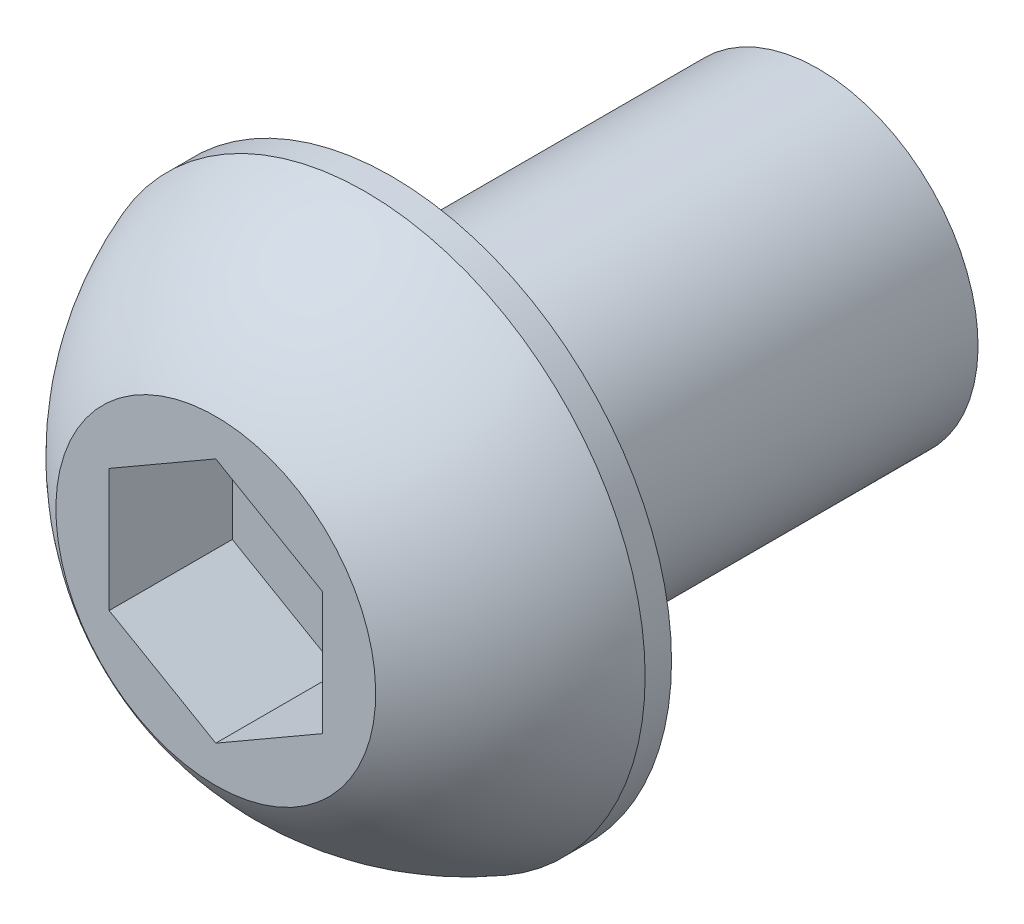
ISO-10303-21;
HEADER;
FILE_DESCRIPTION(('STEP AP214'),'2;1');
FILE_NAME('part.step','',(''),(''),'','','');
FILE_SCHEMA(('AUTOMOTIVE_DESIGN { 1 0 10303 214 1 1 1 1 }'));
ENDSEC;
DATA;
#1=APPLICATION_CONTEXT('core data for automotive mechanical design processes');
#2=APPLICATION_PROTOCOL_DEFINITION('international standard','automotive_design',2000,#1);
#3=PRODUCT_CONTEXT('',#1,'mechanical');
#4=PRODUCT('Part','Part','',(#3));
#5=PRODUCT_RELATED_PRODUCT_CATEGORY('part','',(#4));
#6=PRODUCT_DEFINITION_FORMATION('','',#4);
#7=PRODUCT_DEFINITION_CONTEXT('part definition',#1,'design');
#8=PRODUCT_DEFINITION('design','',#6,#7);
#9=PRODUCT_DEFINITION_SHAPE('','',#8);
#10=(LENGTH_UNIT() NAMED_UNIT(*) SI_UNIT(.MILLI.,.METRE.));
#11=(NAMED_UNIT(*) PLANE_ANGLE_UNIT() SI_UNIT($,.RADIAN.));
#12=(NAMED_UNIT(*) SI_UNIT($,.STERADIAN.) SOLID_ANGLE_UNIT());
#13=UNCERTAINTY_MEASURE_WITH_UNIT(LENGTH_MEASURE(1.E-05),#10,'distance_accuracy_value','');
#14=(GEOMETRIC_REPRESENTATION_CONTEXT(3) GLOBAL_UNCERTAINTY_ASSIGNED_CONTEXT((#13)) GLOBAL_UNIT_ASSIGNED_CONTEXT((#10,
#11,#12)) REPRESENTATION_CONTEXT('',''));
#15=CARTESIAN_POINT('',(0.,0.,0.));
#16=DIRECTION('',(0.,0.,1.));
#17=DIRECTION('',(1.,0.,0.));
#18=AXIS2_PLACEMENT_3D('',#15,#16,#17);
#19=CARTESIAN_POINT('',(0.,-3.,-11.3));
#20=DIRECTION('',(0.,0.,-1.));
#21=DIRECTION('',(0.,1.,0.));
#22=AXIS2_PLACEMENT_3D('',#19,#20,#21);
#23=PLANE('',#22);
#24=CARTESIAN_POINT('',(0.,0.,-11.3));
#25=DIRECTION('',(0.,0.,-1.));
#26=DIRECTION('',(0.,1.,0.));
#27=AXIS2_PLACEMENT_3D('',#24,#25,#26);
#28=CIRCLE('',#27,3.);
#29=CARTESIAN_POINT('',(0.,3.,-11.3));
#30=VERTEX_POINT('',#29);
#31=EDGE_CURVE('E11',#30,#30,#28,.T.);
#32=ORIENTED_EDGE('',*,*,#31,.T.);
#33=EDGE_LOOP('',(#32));
#34=FACE_BOUND('',#33,.T.);
#35=ADVANCED_FACE('F37',(#34),#23,.T.);
#36=CARTESIAN_POINT('',(0.,0.,-11.3));
#37=DIRECTION('',(0.,0.,-1.));
#38=DIRECTION('',(0.,1.,0.));
#39=AXIS2_PLACEMENT_3D('',#36,#37,#38);
#40=CYLINDRICAL_SURFACE('',#39,3.);
#41=CARTESIAN_POINT('',(0.,0.,-3.3));
#42=DIRECTION('',(0.,0.,1.));
#43=DIRECTION('',(1.,0.,0.));
#44=AXIS2_PLACEMENT_3D('',#41,#42,#43);
#45=CIRCLE('',#44,3.);
#46=CARTESIAN_POINT('',(3.,0.,-3.3));
#47=VERTEX_POINT('',#46);
#48=EDGE_CURVE('E44',#47,#47,#45,.F.);
#49=ORIENTED_EDGE('',*,*,#48,.T.);
#50=EDGE_LOOP('',(#49));
#51=FACE_BOUND('',#50,.T.);
#52=ORIENTED_EDGE('',*,*,#31,.F.);
#53=EDGE_LOOP('',(#52));
#54=FACE_BOUND('',#53,.T.);
#55=ADVANCED_FACE('F154',(#51,#54),#40,.T.);
#56=CARTESIAN_POINT('',(0.,0.,-4.71132352941176));
#57=DIRECTION('',(0.,0.,1.));
#58=DIRECTION('',(0.,-1.,0.));
#59=AXIS2_PLACEMENT_3D('',#56,#57,#58);
#60=SPHERICAL_SURFACE('',#59,5.58538892099636);
#61=CARTESIAN_POINT('',(0.,0.,0.));
#62=DIRECTION('',(0.,0.,1.));
#63=DIRECTION('',(1.,0.,0.));
#64=AXIS2_PLACEMENT_3D('',#61,#62,#63);
#65=CIRCLE('',#64,3.);
#66=CARTESIAN_POINT('',(0.,-3.,0.));
#67=VERTEX_POINT('',#66);
#68=EDGE_CURVE('E149',#67,#67,#65,.T.);
#69=CARTESIAN_POINT('',(0.,0.,-2.805));
#70=DIRECTION('',(0.,0.,1.));
#71=DIRECTION('',(1.,0.,0.));
#72=AXIS2_PLACEMENT_3D('',#69,#70,#71);
#73=CIRCLE('',#72,5.25);
#74=CARTESIAN_POINT('',(0.,-5.25,-2.805));
#75=VERTEX_POINT('',#74);
#76=EDGE_CURVE('E138',#75,#75,#73,.T.);
#77=CARTESIAN_POINT('',(0.,-3.,0.));
#78=CARTESIAN_POINT('',(0.,-3.03216841047471,-0.0204836076687075));
#79=CARTESIAN_POINT('',(0.,-3.06412696701745,-0.041296774706015));
#80=CARTESIAN_POINT('',(0.,-3.12761110680185,-0.0835732798883759));
#81=CARTESIAN_POINT('',(0.,-3.1591366900435,-0.105036618033429));
#82=CARTESIAN_POINT('',(0.,-3.22174161778856,-0.148604517801824));
#83=CARTESIAN_POINT('',(0.,-3.25282096229196,-0.170709079425165));
#84=CARTESIAN_POINT('',(0.,-3.3145203830256,-0.215550136391723));
#85=CARTESIAN_POINT('',(0.,-3.34514045925583,-0.238286631734939));
#86=CARTESIAN_POINT('',(0.,-3.40590849355866,-0.284382020830629));
#87=CARTESIAN_POINT('',(0.,-3.43605645163127,-0.307740914583101));
#88=CARTESIAN_POINT('',(0.,-3.49586760131366,-0.355071298801884));
#89=CARTESIAN_POINT('',(0.,-3.52553079292345,-0.379042789268194));
#90=CARTESIAN_POINT('',(0.,-3.58435996382991,-0.427588309600938));
#91=CARTESIAN_POINT('',(0.,-3.61352594312657,-0.452162339467372));
#92=CARTESIAN_POINT('',(0.,-3.67134845242053,-0.501902628105114));
#93=CARTESIAN_POINT('',(0.,-3.70000498241782,-0.527068886876422));
#94=CARTESIAN_POINT('',(0.,-3.7567965698069,-0.577983074450792));
#95=CARTESIAN_POINT('',(0.,-3.78493162719868,-0.603731003253854));
#96=CARTESIAN_POINT('',(0.,-3.84066846488057,-0.65579772794287));
#97=CARTESIAN_POINT('',(0.,-3.86827024517066,-0.682116523828823));
#98=CARTESIAN_POINT('',(0.,-3.92292894789283,-0.735313940225864));
#99=CARTESIAN_POINT('',(0.,-3.94998587032491,-0.762192560736952));
#100=CARTESIAN_POINT('',(0.,-4.00354350517958,-0.816498349041451));
#101=CARTESIAN_POINT('',(0.,-4.03004421760217,-0.843925516834863));
#102=CARTESIAN_POINT('',(0.,-4.08247831365261,-0.899316892210194));
#103=CARTESIAN_POINT('',(0.,-4.10841169728045,-0.927281099792113));
#104=CARTESIAN_POINT('',(0.,-4.1597002549878,-0.983734821927126));
#105=CARTESIAN_POINT('',(0.,-4.18505542906731,-1.01222433648022));
#106=CARTESIAN_POINT('',(0.,-4.23517692952119,-1.06971671933959));
#107=CARTESIAN_POINT('',(0.,-4.25994325589556,-1.09871958764587));
#108=CARTESIAN_POINT('',(0.,-4.30887666984256,-1.15722650940808));
#109=CARTESIAN_POINT('',(0.,-4.33304375741518,-1.18673056286401));
#110=CARTESIAN_POINT('',(0.,-4.38076855408201,-1.24622747604199));
#111=CARTESIAN_POINT('',(0.,-4.40432626317621,-1.27622033576403));
#112=CARTESIAN_POINT('',(0.,-4.45082241888372,-1.33668227750444));
#113=CARTESIAN_POINT('',(0.,-4.47376086549703,-1.3671513595228));
#114=CARTESIAN_POINT('',(0.,-4.51900887206146,-1.4285529620796));
#115=CARTESIAN_POINT('',(0.,-4.54131843201258,-1.45948548261803));
#116=CARTESIAN_POINT('',(0.,-4.58529930493053,-1.52180098399588));
#117=CARTESIAN_POINT('',(0.,-4.60697061789735,-1.5531839648353));
#118=CARTESIAN_POINT('',(0.,-4.64966590431095,-1.61638721959847));
#119=CARTESIAN_POINT('',(0.,-4.67068987775773,-1.64820749352221));
#120=CARTESIAN_POINT('',(0.,-4.71208166419702,-1.71227198376418));
#121=CARTESIAN_POINT('',(0.,-4.73244947718953,-1.74451620008241));
#122=CARTESIAN_POINT('',(0.,-4.77252039708775,-1.80941504655213));
#123=CARTESIAN_POINT('',(0.,-4.79222350399347,-1.84206967670363));
#124=CARTESIAN_POINT('',(0.,-4.83095674497554,-1.90777565008234));
#125=CARTESIAN_POINT('',(0.,-4.84998687905189,-1.94082699330955));
#126=CARTESIAN_POINT('',(0.,-4.8873661899807,-2.00731252563814));
#127=CARTESIAN_POINT('',(0.,-4.90571536683316,-2.04074671473953));
#128=CARTESIAN_POINT('',(0.,-4.94172506465618,-2.10798391097428));
#129=CARTESIAN_POINT('',(0.,-4.95938558562673,-2.14178691810765));
#130=CARTESIAN_POINT('',(0.,-4.99401056185103,-2.20974756786458));
#131=CARTESIAN_POINT('',(0.,-5.01097501710478,-2.24390521048815));
#132=CARTESIAN_POINT('',(0.,-5.04420074452798,-2.31256079972767));
#133=CARTESIAN_POINT('',(0.,-5.06046201669743,-2.34705874634363));
#134=CARTESIAN_POINT('',(0.,-5.09227455404011,-2.41638046989934));
#135=CARTESIAN_POINT('',(0.,-5.10782581921333,-2.45120424683909));
#136=CARTESIAN_POINT('',(0.,-5.13821182242717,-2.52116301839372));
#137=CARTESIAN_POINT('',(0.,-5.15304656046779,-2.5562980130086));
#138=CARTESIAN_POINT('',(0.,-5.18199326796146,-2.62686448517116));
#139=CARTESIAN_POINT('',(0.,-5.19610523741451,-2.66229596271883));
#140=CARTESIAN_POINT('',(0.,-5.22360055144049,-2.7334405099534));
#141=CARTESIAN_POINT('',(0.,-5.23698389601341,-2.76915357964029));
#142=CARTESIAN_POINT('',(0.,-5.25,-2.805));
#143=B_SPLINE_CURVE_WITH_KNOTS('',3,(#77,#78,#79,#80,#81,#82,#83,#84,#85,#86,#87,#88,#89,#90,
#91,#92,#93,#94,#95,#96,#97,#98,#99,#100,#101,#102,#103,#104,#105,#106,#107,#108,#109,#110,#111,
#112,#113,#114,#115,#116,#117,#118,#119,#120,#121,#122,#123,#124,#125,#126,#127,#128,#129,#130,
#131,#132,#133,#134,#135,#136,#137,#138,#139,#140,#141,#142),.UNSPECIFIED.,.F.,.F.,(4,2,2,2,2,2,
2,2,2,2,2,2,2,2,2,2,2,2,2,2,2,2,2,2,2,2,2,2,2,2,2,2,4),(0.,0.114407188898183,0.228814377796368,
0.343221566694552,0.457628755592736,0.57203594449092,0.686443133389104,0.800850322287287,
0.915257511185472,1.02966470008366,1.14407188898184,1.25847907788002,1.37288626677821,
1.48729345567639,1.60170064457457,1.71610783347276,1.83051502237094,1.94492221126913,
2.05932940016731,2.17373658906549,2.28814377796368,2.40255096686186,2.51695815576005,
2.63136534465823,2.74577253355641,2.8601797224546,2.97458691135278,3.08899410025097,
3.20340128914915,3.31780847804733,3.43221566694552,3.5466228558437,3.66103004474188),.UNSPECIFIED.);
#144=EDGE_CURVE('BSEAM180',#67,#75,#143,.T.);
#145=ORIENTED_EDGE('',*,*,#68,.F.);
#146=ORIENTED_EDGE('',*,*,#76,.T.);
#147=ORIENTED_EDGE('',*,*,#144,.T.);
#148=ORIENTED_EDGE('',*,*,#144,.F.);
#149=EDGE_LOOP('',(#145,#147,#146,#148));
#150=FACE_BOUND('',#149,.T.);
#151=ADVANCED_FACE('F180',(#150),#60,.T.);
#152=CARTESIAN_POINT('',(0.,-3.,0.));
#153=DIRECTION('',(0.,0.,-1.));
#154=DIRECTION('',(-1.,0.,0.));
#155=AXIS2_PLACEMENT_3D('',#152,#153,#154);
#156=PLANE('',#155);
#157=DIRECTION('',(0.,1.,0.));
#158=VECTOR('',#157,1.);
#159=CARTESIAN_POINT('',(2.,-1.15470053837925,0.));
#160=LINE('',#159,#158);
#161=CARTESIAN_POINT('',(2.,-1.15470053837925,0.));
#162=VERTEX_POINT('',#161);
#163=CARTESIAN_POINT('',(2.,1.15470053837925,0.));
#164=VERTEX_POINT('',#163);
#165=EDGE_CURVE('E125',#162,#164,#160,.T.);
#166=ORIENTED_EDGE('',*,*,#165,.F.);
#167=DIRECTION('',(0.866025403784438,0.5,0.));
#168=VECTOR('',#167,1.);
#169=CARTESIAN_POINT('',(0.,-2.3094010767585,0.));
#170=LINE('',#169,#168);
#171=CARTESIAN_POINT('',(0.,-2.3094010767585,0.));
#172=VERTEX_POINT('',#171);
#173=EDGE_CURVE('E51',#172,#162,#170,.T.);
#174=ORIENTED_EDGE('',*,*,#173,.F.);
#175=DIRECTION('',(0.866025403784439,-0.5,0.));
#176=VECTOR('',#175,1.);
#177=CARTESIAN_POINT('',(-2.,-1.15470053837925,0.));
#178=LINE('',#177,#176);
#179=CARTESIAN_POINT('',(-2.,-1.15470053837925,0.));
#180=VERTEX_POINT('',#179);
#181=EDGE_CURVE('E134',#180,#172,#178,.T.);
#182=ORIENTED_EDGE('',*,*,#181,.F.);
#183=DIRECTION('',(0.,-1.,0.));
#184=VECTOR('',#183,1.);
#185=CARTESIAN_POINT('',(-2.,1.15470053837925,0.));
#186=LINE('',#185,#184);
#187=CARTESIAN_POINT('',(-2.,1.15470053837925,0.));
#188=VERTEX_POINT('',#187);
#189=EDGE_CURVE('E132',#188,#180,#186,.T.);
#190=ORIENTED_EDGE('',*,*,#189,.F.);
#191=DIRECTION('',(-0.866025403784438,-0.5,0.));
#192=VECTOR('',#191,1.);
#193=CARTESIAN_POINT('',(0.,2.3094010767585,0.));
#194=LINE('',#193,#192);
#195=CARTESIAN_POINT('',(0.,2.3094010767585,0.));
#196=VERTEX_POINT('',#195);
#197=EDGE_CURVE('E99',#196,#188,#194,.T.);
#198=ORIENTED_EDGE('',*,*,#197,.F.);
#199=DIRECTION('',(-0.866025403784439,0.5,0.));
#200=VECTOR('',#199,1.);
#201=CARTESIAN_POINT('',(2.,1.15470053837925,0.));
#202=LINE('',#201,#200);
#203=EDGE_CURVE('E128',#164,#196,#202,.T.);
#204=ORIENTED_EDGE('',*,*,#203,.F.);
#205=EDGE_LOOP('',(#166,#174,#182,#190,#198,#204));
#206=FACE_BOUND('',#205,.T.);
#207=ORIENTED_EDGE('',*,*,#68,.T.);
#208=EDGE_LOOP('',(#207));
#209=FACE_BOUND('',#208,.T.);
#210=ADVANCED_FACE('F161',(#206,#209),#156,.F.);
#211=CARTESIAN_POINT('',(0.,-5.25,-3.3));
#212=DIRECTION('',(0.,0.,1.));
#213=DIRECTION('',(1.,0.,0.));
#214=AXIS2_PLACEMENT_3D('',#211,#212,#213);
#215=PLANE('',#214);
#216=ORIENTED_EDGE('',*,*,#48,.F.);
#217=EDGE_LOOP('',(#216));
#218=FACE_BOUND('',#217,.T.);
#219=CARTESIAN_POINT('',(0.,0.,-3.3));
#220=DIRECTION('',(0.,0.,1.));
#221=DIRECTION('',(1.,0.,0.));
#222=AXIS2_PLACEMENT_3D('',#219,#220,#221);
#223=CIRCLE('',#222,5.25);
#224=CARTESIAN_POINT('',(5.25,0.,-3.3));
#225=VERTEX_POINT('',#224);
#226=EDGE_CURVE('E146',#225,#225,#223,.T.);
#227=ORIENTED_EDGE('',*,*,#226,.F.);
#228=EDGE_LOOP('',(#227));
#229=FACE_BOUND('',#228,.T.);
#230=ADVANCED_FACE('F157',(#218,#229),#215,.F.);
#231=CARTESIAN_POINT('',(0.,0.,0.));
#232=DIRECTION('',(0.,0.,1.));
#233=DIRECTION('',(1.,0.,0.));
#234=AXIS2_PLACEMENT_3D('',#231,#232,#233);
#235=CYLINDRICAL_SURFACE('',#234,5.25);
#236=ORIENTED_EDGE('',*,*,#76,.F.);
#237=EDGE_LOOP('',(#236));
#238=FACE_BOUND('',#237,.T.);
#239=ORIENTED_EDGE('',*,*,#226,.T.);
#240=EDGE_LOOP('',(#239));
#241=FACE_BOUND('',#240,.T.);
#242=ADVANCED_FACE('F160',(#238,#241),#235,.T.);
#243=CARTESIAN_POINT('',(0.,-2.3094010767585,-2.31));
#244=DIRECTION('',(0.5,-0.866025403784439,0.));
#245=DIRECTION('',(0.866025403784439,0.5,0.));
#246=AXIS2_PLACEMENT_3D('',#243,#244,#245);
#247=PLANE('',#246);
#248=ORIENTED_EDGE('',*,*,#173,.T.);
#249=DIRECTION('',(0.,0.,1.));
#250=VECTOR('',#249,1.);
#251=CARTESIAN_POINT('',(2.,-1.15470053837925,-2.31));
#252=LINE('',#251,#250);
#253=CARTESIAN_POINT('',(2.,-1.15470053837925,-2.31));
#254=VERTEX_POINT('',#253);
#255=EDGE_CURVE('E81',#254,#162,#252,.T.);
#256=ORIENTED_EDGE('',*,*,#255,.F.);
#257=DIRECTION('',(0.866025403784438,0.5,0.));
#258=VECTOR('',#257,1.);
#259=CARTESIAN_POINT('',(0.,-2.3094010767585,-2.31));
#260=LINE('',#259,#258);
#261=CARTESIAN_POINT('',(0.,-2.3094010767585,-2.31));
#262=VERTEX_POINT('',#261);
#263=EDGE_CURVE('E136',#262,#254,#260,.T.);
#264=ORIENTED_EDGE('',*,*,#263,.F.);
#265=DIRECTION('',(0.,0.,1.));
#266=VECTOR('',#265,1.);
#267=CARTESIAN_POINT('',(0.,-2.3094010767585,-2.31));
#268=LINE('',#267,#266);
#269=EDGE_CURVE('E59',#262,#172,#268,.T.);
#270=ORIENTED_EDGE('',*,*,#269,.T.);
#271=EDGE_LOOP('',(#248,#256,#264,#270));
#272=FACE_BOUND('',#271,.T.);
#273=ADVANCED_FACE('F166',(#272),#247,.F.);
#274=CARTESIAN_POINT('',(-2.,-1.15470053837925,-2.31));
#275=DIRECTION('',(-0.5,-0.866025403784439,0.));
#276=DIRECTION('',(0.866025403784439,-0.5,0.));
#277=AXIS2_PLACEMENT_3D('',#274,#275,#276);
#278=PLANE('',#277);
#279=ORIENTED_EDGE('',*,*,#181,.T.);
#280=ORIENTED_EDGE('',*,*,#269,.F.);
#281=DIRECTION('',(0.866025403784439,-0.5,0.));
#282=VECTOR('',#281,1.);
#283=CARTESIAN_POINT('',(-2.,-1.15470053837925,-2.31));
#284=LINE('',#283,#282);
#285=CARTESIAN_POINT('',(-2.,-1.15470053837925,-2.31));
#286=VERTEX_POINT('',#285);
#287=EDGE_CURVE('E111',#286,#262,#284,.T.);
#288=ORIENTED_EDGE('',*,*,#287,.F.);
#289=DIRECTION('',(0.,0.,1.));
#290=VECTOR('',#289,1.);
#291=CARTESIAN_POINT('',(-2.,-1.15470053837925,-2.31));
#292=LINE('',#291,#290);
#293=EDGE_CURVE('E103',#286,#180,#292,.T.);
#294=ORIENTED_EDGE('',*,*,#293,.T.);
#295=EDGE_LOOP('',(#279,#280,#288,#294));
#296=FACE_BOUND('',#295,.T.);
#297=ADVANCED_FACE('F172',(#296),#278,.F.);
#298=CARTESIAN_POINT('',(-2.,1.15470053837925,-2.31));
#299=DIRECTION('',(-1.,0.,0.));
#300=DIRECTION('',(0.,-1.,0.));
#301=AXIS2_PLACEMENT_3D('',#298,#299,#300);
#302=PLANE('',#301);
#303=ORIENTED_EDGE('',*,*,#189,.T.);
#304=ORIENTED_EDGE('',*,*,#293,.F.);
#305=DIRECTION('',(0.,-1.,0.));
#306=VECTOR('',#305,1.);
#307=CARTESIAN_POINT('',(-2.,1.15470053837925,-2.31));
#308=LINE('',#307,#306);
#309=CARTESIAN_POINT('',(-2.,1.15470053837925,-2.31));
#310=VERTEX_POINT('',#309);
#311=EDGE_CURVE('E107',#310,#286,#308,.T.);
#312=ORIENTED_EDGE('',*,*,#311,.F.);
#313=DIRECTION('',(0.,0.,1.));
#314=VECTOR('',#313,1.);
#315=CARTESIAN_POINT('',(-2.,1.15470053837925,-2.31));
#316=LINE('',#315,#314);
#317=EDGE_CURVE('E92',#310,#188,#316,.T.);
#318=ORIENTED_EDGE('',*,*,#317,.T.);
#319=EDGE_LOOP('',(#303,#304,#312,#318));
#320=FACE_BOUND('',#319,.T.);
#321=ADVANCED_FACE('F108',(#320),#302,.F.);
#322=CARTESIAN_POINT('',(0.,2.3094010767585,-2.31));
#323=DIRECTION('',(-0.5,0.866025403784439,0.));
#324=DIRECTION('',(-0.866025403784439,-0.5,0.));
#325=AXIS2_PLACEMENT_3D('',#322,#323,#324);
#326=PLANE('',#325);
#327=ORIENTED_EDGE('',*,*,#197,.T.);
#328=ORIENTED_EDGE('',*,*,#317,.F.);
#329=DIRECTION('',(-0.866025403784438,-0.5,0.));
#330=VECTOR('',#329,1.);
#331=CARTESIAN_POINT('',(0.,2.3094010767585,-2.31));
#332=LINE('',#331,#330);
#333=CARTESIAN_POINT('',(0.,2.3094010767585,-2.31));
#334=VERTEX_POINT('',#333);
#335=EDGE_CURVE('E96',#334,#310,#332,.T.);
#336=ORIENTED_EDGE('',*,*,#335,.F.);
#337=DIRECTION('',(0.,0.,1.));
#338=VECTOR('',#337,1.);
#339=CARTESIAN_POINT('',(0.,2.3094010767585,-2.31));
#340=LINE('',#339,#338);
#341=EDGE_CURVE('E104',#334,#196,#340,.T.);
#342=ORIENTED_EDGE('',*,*,#341,.T.);
#343=EDGE_LOOP('',(#327,#328,#336,#342));
#344=FACE_BOUND('',#343,.T.);
#345=ADVANCED_FACE('F94',(#344),#326,.F.);
#346=CARTESIAN_POINT('',(2.,1.15470053837925,-2.31));
#347=DIRECTION('',(0.5,0.866025403784439,0.));
#348=DIRECTION('',(-0.866025403784439,0.5,0.));
#349=AXIS2_PLACEMENT_3D('',#346,#347,#348);
#350=PLANE('',#349);
#351=ORIENTED_EDGE('',*,*,#203,.T.);
#352=ORIENTED_EDGE('',*,*,#341,.F.);
#353=DIRECTION('',(-0.866025403784439,0.5,0.));
#354=VECTOR('',#353,1.);
#355=CARTESIAN_POINT('',(2.,1.15470053837925,-2.31));
#356=LINE('',#355,#354);
#357=CARTESIAN_POINT('',(2.,1.15470053837925,-2.31));
#358=VERTEX_POINT('',#357);
#359=EDGE_CURVE('E117',#358,#334,#356,.T.);
#360=ORIENTED_EDGE('',*,*,#359,.F.);
#361=DIRECTION('',(0.,0.,1.));
#362=VECTOR('',#361,1.);
#363=CARTESIAN_POINT('',(2.,1.15470053837925,-2.31));
#364=LINE('',#363,#362);
#365=EDGE_CURVE('E141',#358,#164,#364,.T.);
#366=ORIENTED_EDGE('',*,*,#365,.T.);
#367=EDGE_LOOP('',(#351,#352,#360,#366));
#368=FACE_BOUND('',#367,.T.);
#369=ADVANCED_FACE('F211',(#368),#350,.F.);
#370=CARTESIAN_POINT('',(2.,-1.15470053837925,-2.31));
#371=DIRECTION('',(1.,0.,0.));
#372=DIRECTION('',(0.,0.,-1.));
#373=AXIS2_PLACEMENT_3D('',#370,#371,#372);
#374=PLANE('',#373);
#375=ORIENTED_EDGE('',*,*,#165,.T.);
#376=ORIENTED_EDGE('',*,*,#365,.F.);
#377=DIRECTION('',(0.,1.,0.));
#378=VECTOR('',#377,1.);
#379=CARTESIAN_POINT('',(2.,-1.15470053837925,-2.31));
#380=LINE('',#379,#378);
#381=EDGE_CURVE('E119',#254,#358,#380,.T.);
#382=ORIENTED_EDGE('',*,*,#381,.F.);
#383=ORIENTED_EDGE('',*,*,#255,.T.);
#384=EDGE_LOOP('',(#375,#376,#382,#383));
#385=FACE_BOUND('',#384,.T.);
#386=ADVANCED_FACE('F199',(#385),#374,.F.);
#387=CARTESIAN_POINT('',(2.,-1.15470053837925,-2.31));
#388=DIRECTION('',(0.,0.,1.));
#389=DIRECTION('',(1.,0.,0.));
#390=AXIS2_PLACEMENT_3D('',#387,#388,#389);
#391=PLANE('',#390);
#392=ORIENTED_EDGE('',*,*,#263,.T.);
#393=ORIENTED_EDGE('',*,*,#381,.T.);
#394=ORIENTED_EDGE('',*,*,#359,.T.);
#395=ORIENTED_EDGE('',*,*,#335,.T.);
#396=ORIENTED_EDGE('',*,*,#311,.T.);
#397=ORIENTED_EDGE('',*,*,#287,.T.);
#398=EDGE_LOOP('',(#392,#393,#394,#395,#396,#397));
#399=FACE_BOUND('',#398,.T.);
#400=ADVANCED_FACE('F114',(#399),#391,.T.);
#401=CLOSED_SHELL('',(#35,#55,#151,#210,#230,#242,#273,#297,#321,#345,#369,#386,#400));
#402=MANIFOLD_SOLID_BREP('B2',#401);
#403=ADVANCED_BREP_SHAPE_REPRESENTATION('',(#18,#402),#14);
#404=SHAPE_DEFINITION_REPRESENTATION(#9,#403);
ENDSEC;
END-ISO-10303-21;
